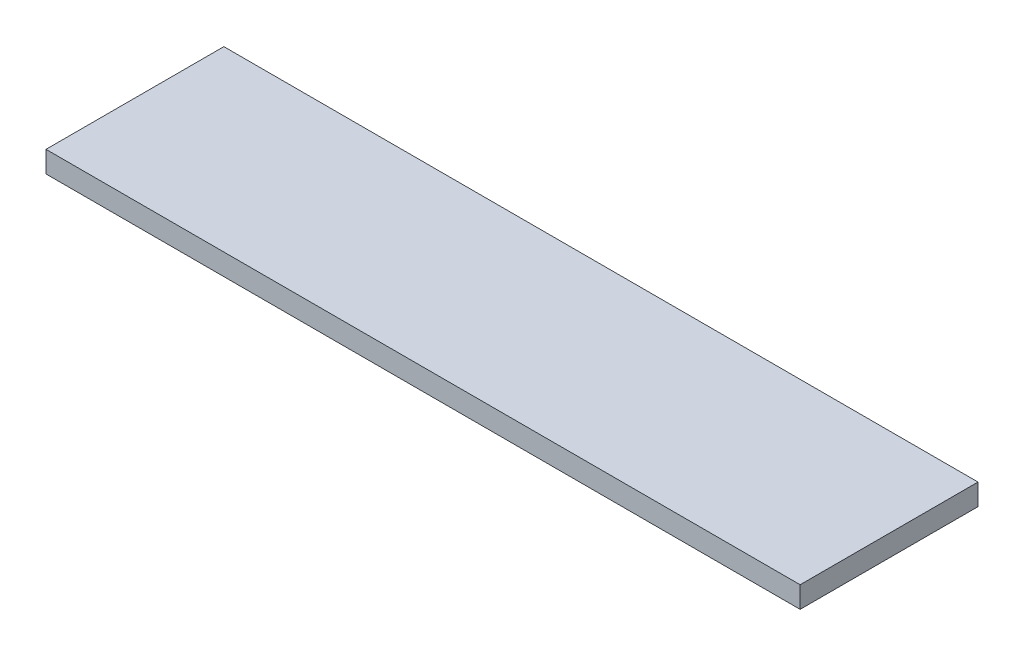
ISO-10303-21;
HEADER;
FILE_DESCRIPTION(('STEP AP214'),'2;1');
FILE_NAME('part.step','',(''),(''),'','','');
FILE_SCHEMA(('AUTOMOTIVE_DESIGN { 1 0 10303 214 1 1 1 1 }'));
ENDSEC;
DATA;
#1=APPLICATION_CONTEXT('core data for automotive mechanical design processes');
#2=APPLICATION_PROTOCOL_DEFINITION('international standard','automotive_design',2000,#1);
#3=PRODUCT_CONTEXT('',#1,'mechanical');
#4=PRODUCT('Part','Part','',(#3));
#5=PRODUCT_RELATED_PRODUCT_CATEGORY('part','',(#4));
#6=PRODUCT_DEFINITION_FORMATION('','',#4);
#7=PRODUCT_DEFINITION_CONTEXT('part definition',#1,'design');
#8=PRODUCT_DEFINITION('design','',#6,#7);
#9=PRODUCT_DEFINITION_SHAPE('','',#8);
#10=(LENGTH_UNIT() NAMED_UNIT(*) SI_UNIT(.MILLI.,.METRE.));
#11=(NAMED_UNIT(*) PLANE_ANGLE_UNIT() SI_UNIT($,.RADIAN.));
#12=(NAMED_UNIT(*) SI_UNIT($,.STERADIAN.) SOLID_ANGLE_UNIT());
#13=UNCERTAINTY_MEASURE_WITH_UNIT(LENGTH_MEASURE(1.E-05),#10,'distance_accuracy_value','');
#14=(GEOMETRIC_REPRESENTATION_CONTEXT(3) GLOBAL_UNCERTAINTY_ASSIGNED_CONTEXT((#13)) GLOBAL_UNIT_ASSIGNED_CONTEXT((#10,
#11,#12)) REPRESENTATION_CONTEXT('',''));
#15=CARTESIAN_POINT('',(0.,0.,0.));
#16=DIRECTION('',(0.,0.,1.));
#17=DIRECTION('',(1.,0.,0.));
#18=AXIS2_PLACEMENT_3D('',#15,#16,#17);
#19=CARTESIAN_POINT('',(0.,6.,0.));
#20=DIRECTION('',(1.,0.,0.));
#21=DIRECTION('',(0.,0.,-1.));
#22=AXIS2_PLACEMENT_3D('',#19,#20,#21);
#23=PLANE('',#22);
#24=DIRECTION('',(0.,0.,1.));
#25=VECTOR('',#24,1.);
#26=CARTESIAN_POINT('',(0.,0.,0.));
#27=LINE('',#26,#25);
#28=CARTESIAN_POINT('',(0.,0.,-50.));
#29=VERTEX_POINT('',#28);
#30=CARTESIAN_POINT('',(0.,0.,0.));
#31=VERTEX_POINT('',#30);
#32=EDGE_CURVE('E96',#29,#31,#27,.T.);
#33=ORIENTED_EDGE('',*,*,#32,.T.);
#34=DIRECTION('',(0.,-1.,0.));
#35=VECTOR('',#34,1.);
#36=CARTESIAN_POINT('',(0.,6.,0.));
#37=LINE('',#36,#35);
#38=CARTESIAN_POINT('',(0.,6.,0.));
#39=VERTEX_POINT('',#38);
#40=EDGE_CURVE('E11',#39,#31,#37,.T.);
#41=ORIENTED_EDGE('',*,*,#40,.F.);
#42=DIRECTION('',(0.,0.,1.));
#43=VECTOR('',#42,1.);
#44=CARTESIAN_POINT('',(0.,6.,0.));
#45=LINE('',#44,#43);
#46=CARTESIAN_POINT('',(0.,6.,-50.));
#47=VERTEX_POINT('',#46);
#48=EDGE_CURVE('E84',#47,#39,#45,.T.);
#49=ORIENTED_EDGE('',*,*,#48,.F.);
#50=DIRECTION('',(0.,-1.,0.));
#51=VECTOR('',#50,1.);
#52=CARTESIAN_POINT('',(0.,6.,-50.));
#53=LINE('',#52,#51);
#54=EDGE_CURVE('E92',#47,#29,#53,.T.);
#55=ORIENTED_EDGE('',*,*,#54,.T.);
#56=EDGE_LOOP('',(#33,#41,#49,#55));
#57=FACE_BOUND('',#56,.T.);
#58=ADVANCED_FACE('F33',(#57),#23,.F.);
#59=CARTESIAN_POINT('',(0.,6.,0.));
#60=DIRECTION('',(0.,0.,-1.));
#61=DIRECTION('',(-1.,0.,0.));
#62=AXIS2_PLACEMENT_3D('',#59,#60,#61);
#63=PLANE('',#62);
#64=DIRECTION('',(1.,0.,0.));
#65=VECTOR('',#64,1.);
#66=CARTESIAN_POINT('',(0.,0.,0.));
#67=LINE('',#66,#65);
#68=CARTESIAN_POINT('',(212.,0.,0.));
#69=VERTEX_POINT('',#68);
#70=EDGE_CURVE('E88',#31,#69,#67,.T.);
#71=ORIENTED_EDGE('',*,*,#70,.T.);
#72=DIRECTION('',(0.,-1.,0.));
#73=VECTOR('',#72,1.);
#74=CARTESIAN_POINT('',(212.,6.,0.));
#75=LINE('',#74,#73);
#76=CARTESIAN_POINT('',(212.,6.,0.));
#77=VERTEX_POINT('',#76);
#78=EDGE_CURVE('E41',#77,#69,#75,.T.);
#79=ORIENTED_EDGE('',*,*,#78,.F.);
#80=DIRECTION('',(1.,0.,0.));
#81=VECTOR('',#80,1.);
#82=CARTESIAN_POINT('',(0.,6.,0.));
#83=LINE('',#82,#81);
#84=EDGE_CURVE('E79',#39,#77,#83,.T.);
#85=ORIENTED_EDGE('',*,*,#84,.F.);
#86=ORIENTED_EDGE('',*,*,#40,.T.);
#87=EDGE_LOOP('',(#71,#79,#85,#86));
#88=FACE_BOUND('',#87,.T.);
#89=ADVANCED_FACE('F87',(#88),#63,.F.);
#90=CARTESIAN_POINT('',(212.,6.,0.));
#91=DIRECTION('',(-1.,0.,0.));
#92=DIRECTION('',(0.,0.,1.));
#93=AXIS2_PLACEMENT_3D('',#90,#91,#92);
#94=PLANE('',#93);
#95=DIRECTION('',(0.,0.,-1.));
#96=VECTOR('',#95,1.);
#97=CARTESIAN_POINT('',(212.,0.,0.));
#98=LINE('',#97,#96);
#99=CARTESIAN_POINT('',(212.,0.,-50.));
#100=VERTEX_POINT('',#99);
#101=EDGE_CURVE('E66',#69,#100,#98,.T.);
#102=ORIENTED_EDGE('',*,*,#101,.T.);
#103=DIRECTION('',(0.,-1.,0.));
#104=VECTOR('',#103,1.);
#105=CARTESIAN_POINT('',(212.,6.,-50.));
#106=LINE('',#105,#104);
#107=CARTESIAN_POINT('',(212.,6.,-50.));
#108=VERTEX_POINT('',#107);
#109=EDGE_CURVE('E89',#108,#100,#106,.T.);
#110=ORIENTED_EDGE('',*,*,#109,.F.);
#111=DIRECTION('',(0.,0.,-1.));
#112=VECTOR('',#111,1.);
#113=CARTESIAN_POINT('',(212.,6.,0.));
#114=LINE('',#113,#112);
#115=EDGE_CURVE('E82',#77,#108,#114,.T.);
#116=ORIENTED_EDGE('',*,*,#115,.F.);
#117=ORIENTED_EDGE('',*,*,#78,.T.);
#118=EDGE_LOOP('',(#102,#110,#116,#117));
#119=FACE_BOUND('',#118,.T.);
#120=ADVANCED_FACE('F90',(#119),#94,.F.);
#121=CARTESIAN_POINT('',(0.,6.,-50.));
#122=DIRECTION('',(0.,0.,1.));
#123=DIRECTION('',(1.,0.,0.));
#124=AXIS2_PLACEMENT_3D('',#121,#122,#123);
#125=PLANE('',#124);
#126=DIRECTION('',(-1.,0.,0.));
#127=VECTOR('',#126,1.);
#128=CARTESIAN_POINT('',(0.,0.,-50.));
#129=LINE('',#128,#127);
#130=EDGE_CURVE('E72',#100,#29,#129,.T.);
#131=ORIENTED_EDGE('',*,*,#130,.T.);
#132=ORIENTED_EDGE('',*,*,#54,.F.);
#133=DIRECTION('',(-1.,0.,0.));
#134=VECTOR('',#133,1.);
#135=CARTESIAN_POINT('',(0.,6.,-50.));
#136=LINE('',#135,#134);
#137=EDGE_CURVE('E49',#108,#47,#136,.T.);
#138=ORIENTED_EDGE('',*,*,#137,.F.);
#139=ORIENTED_EDGE('',*,*,#109,.T.);
#140=EDGE_LOOP('',(#131,#132,#138,#139));
#141=FACE_BOUND('',#140,.T.);
#142=ADVANCED_FACE('F103',(#141),#125,.F.);
#143=CARTESIAN_POINT('',(0.,6.,0.));
#144=DIRECTION('',(0.,-1.,0.));
#145=DIRECTION('',(0.,0.,-1.));
#146=AXIS2_PLACEMENT_3D('',#143,#144,#145);
#147=PLANE('',#146);
#148=ORIENTED_EDGE('',*,*,#48,.T.);
#149=ORIENTED_EDGE('',*,*,#84,.T.);
#150=ORIENTED_EDGE('',*,*,#115,.T.);
#151=ORIENTED_EDGE('',*,*,#137,.T.);
#152=EDGE_LOOP('',(#148,#149,#150,#151));
#153=FACE_BOUND('',#152,.T.);
#154=ADVANCED_FACE('F80',(#153),#147,.F.);
#155=CARTESIAN_POINT('',(0.,0.,0.));
#156=DIRECTION('',(0.,-1.,0.));
#157=DIRECTION('',(0.,0.,-1.));
#158=AXIS2_PLACEMENT_3D('',#155,#156,#157);
#159=PLANE('',#158);
#160=ORIENTED_EDGE('',*,*,#32,.F.);
#161=ORIENTED_EDGE('',*,*,#130,.F.);
#162=ORIENTED_EDGE('',*,*,#101,.F.);
#163=ORIENTED_EDGE('',*,*,#70,.F.);
#164=EDGE_LOOP('',(#160,#161,#162,#163));
#165=FACE_BOUND('',#164,.T.);
#166=ADVANCED_FACE('F106',(#165),#159,.T.);
#167=CLOSED_SHELL('',(#58,#89,#120,#142,#154,#166));
#168=MANIFOLD_SOLID_BREP('B2',#167);
#169=ADVANCED_BREP_SHAPE_REPRESENTATION('',(#18,#168),#14);
#170=SHAPE_DEFINITION_REPRESENTATION(#9,#169);
ENDSEC;
END-ISO-10303-21;
